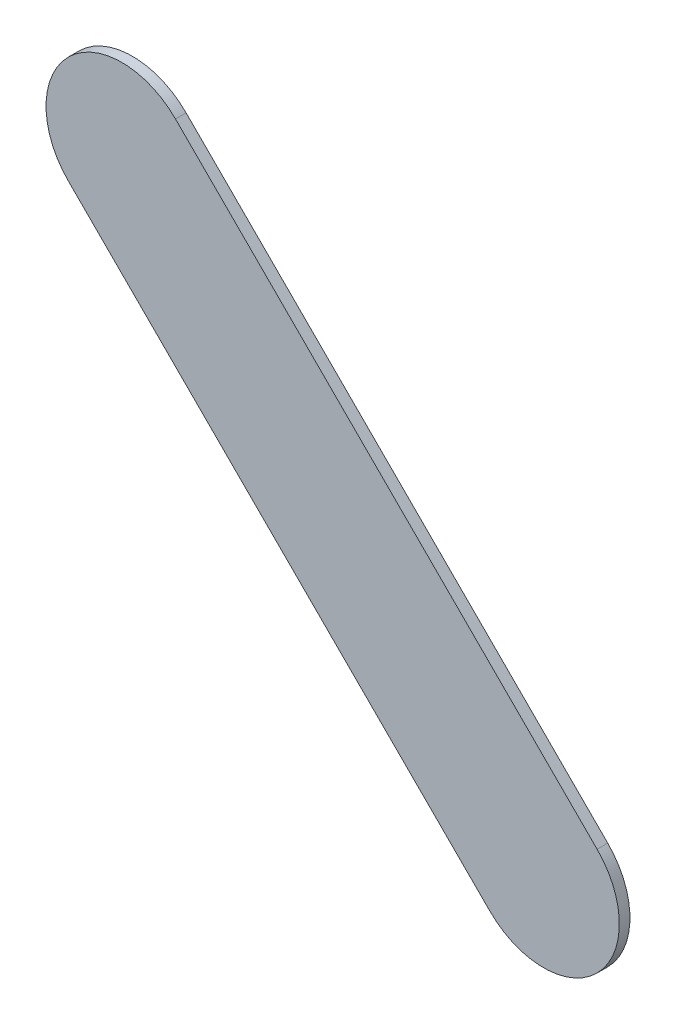
ISO-10303-21;
HEADER;
FILE_DESCRIPTION(('STEP AP214'),'2;1');
FILE_NAME('part.step','',(''),(''),'','','');
FILE_SCHEMA(('AUTOMOTIVE_DESIGN { 1 0 10303 214 1 1 1 1 }'));
ENDSEC;
DATA;
#1=APPLICATION_CONTEXT('core data for automotive mechanical design processes');
#2=APPLICATION_PROTOCOL_DEFINITION('international standard','automotive_design',2000,#1);
#3=PRODUCT_CONTEXT('',#1,'mechanical');
#4=PRODUCT('Part','Part','',(#3));
#5=PRODUCT_RELATED_PRODUCT_CATEGORY('part','',(#4));
#6=PRODUCT_DEFINITION_FORMATION('','',#4);
#7=PRODUCT_DEFINITION_CONTEXT('part definition',#1,'design');
#8=PRODUCT_DEFINITION('design','',#6,#7);
#9=PRODUCT_DEFINITION_SHAPE('','',#8);
#10=(LENGTH_UNIT() NAMED_UNIT(*) SI_UNIT(.MILLI.,.METRE.));
#11=(NAMED_UNIT(*) PLANE_ANGLE_UNIT() SI_UNIT($,.RADIAN.));
#12=(NAMED_UNIT(*) SI_UNIT($,.STERADIAN.) SOLID_ANGLE_UNIT());
#13=UNCERTAINTY_MEASURE_WITH_UNIT(LENGTH_MEASURE(1.E-05),#10,'distance_accuracy_value','');
#14=(GEOMETRIC_REPRESENTATION_CONTEXT(3) GLOBAL_UNCERTAINTY_ASSIGNED_CONTEXT((#13)) GLOBAL_UNIT_ASSIGNED_CONTEXT((#10,
#11,#12)) REPRESENTATION_CONTEXT('',''));
#15=CARTESIAN_POINT('',(0.,0.,0.));
#16=DIRECTION('',(0.,0.,1.));
#17=DIRECTION('',(1.,0.,0.));
#18=AXIS2_PLACEMENT_3D('',#15,#16,#17);
#19=CARTESIAN_POINT('',(104.363223,-71.456776,1.635));
#20=DIRECTION('',(0.,0.,1.));
#21=DIRECTION('',(1.,0.,0.));
#22=AXIS2_PLACEMENT_3D('',#19,#20,#21);
#23=PLANE('',#22);
#24=DIRECTION('',(0.707106781186548,-0.707106781186548,0.));
#25=VECTOR('',#24,1.);
#26=CARTESIAN_POINT('',(104.363223,-71.456776,1.635));
#27=LINE('',#26,#25);
#28=CARTESIAN_POINT('',(104.363223,-71.456776,1.635));
#29=VERTEX_POINT('',#28);
#30=CARTESIAN_POINT('',(105.753223,-72.846776,1.635));
#31=VERTEX_POINT('',#30);
#32=EDGE_CURVE('E69',#29,#31,#27,.T.);
#33=ORIENTED_EDGE('',*,*,#32,.T.);
#34=CARTESIAN_POINT('',(105.9299995,-72.6699995,1.635));
#35=DIRECTION('',(0.,0.,1.));
#36=DIRECTION('',(-0.707106781186548,-0.707106781186548,0.));
#37=AXIS2_PLACEMENT_3D('',#34,#35,#36);
#38=CIRCLE('',#37,0.249999723809);
#39=CARTESIAN_POINT('',(106.106776,-72.493223,1.635));
#40=VERTEX_POINT('',#39);
#41=EDGE_CURVE('E66',#31,#40,#38,.T.);
#42=ORIENTED_EDGE('',*,*,#41,.T.);
#43=DIRECTION('',(-0.707106781186548,0.707106781186548,0.));
#44=VECTOR('',#43,1.);
#45=CARTESIAN_POINT('',(106.106776,-72.493223,1.635));
#46=LINE('',#45,#44);
#47=CARTESIAN_POINT('',(104.716776,-71.103223,1.635));
#48=VERTEX_POINT('',#47);
#49=EDGE_CURVE('E54',#40,#48,#46,.T.);
#50=ORIENTED_EDGE('',*,*,#49,.T.);
#51=CARTESIAN_POINT('',(104.5399995,-71.2799995,1.635));
#52=DIRECTION('',(0.,0.,1.));
#53=DIRECTION('',(0.707106781186548,0.707106781186548,0.));
#54=AXIS2_PLACEMENT_3D('',#51,#52,#53);
#55=CIRCLE('',#54,0.249999723809);
#56=EDGE_CURVE('E11',#48,#29,#55,.T.);
#57=ORIENTED_EDGE('',*,*,#56,.T.);
#58=EDGE_LOOP('',(#33,#42,#50,#57));
#59=FACE_BOUND('',#58,.T.);
#60=ADVANCED_FACE('F17',(#59),#23,.T.);
#61=CARTESIAN_POINT('',(104.363223,-71.456776,1.6));
#62=DIRECTION('',(0.,0.,1.));
#63=DIRECTION('',(1.,0.,0.));
#64=AXIS2_PLACEMENT_3D('',#61,#62,#63);
#65=PLANE('',#64);
#66=CARTESIAN_POINT('',(104.5399995,-71.2799995,1.6));
#67=DIRECTION('',(0.,0.,1.));
#68=DIRECTION('',(0.707106781186548,0.707106781186548,0.));
#69=AXIS2_PLACEMENT_3D('',#66,#67,#68);
#70=CIRCLE('',#69,0.249999723809);
#71=CARTESIAN_POINT('',(104.716776,-71.103223,1.6));
#72=VERTEX_POINT('',#71);
#73=CARTESIAN_POINT('',(104.363223,-71.456776,1.6));
#74=VERTEX_POINT('',#73);
#75=EDGE_CURVE('E20',#72,#74,#70,.T.);
#76=ORIENTED_EDGE('',*,*,#75,.F.);
#77=DIRECTION('',(-0.707106781186548,0.707106781186548,0.));
#78=VECTOR('',#77,1.);
#79=CARTESIAN_POINT('',(106.106776,-72.493223,1.6));
#80=LINE('',#79,#78);
#81=CARTESIAN_POINT('',(106.106776,-72.493223,1.6));
#82=VERTEX_POINT('',#81);
#83=EDGE_CURVE('E74',#82,#72,#80,.T.);
#84=ORIENTED_EDGE('',*,*,#83,.F.);
#85=CARTESIAN_POINT('',(105.9299995,-72.6699995,1.6));
#86=DIRECTION('',(0.,0.,1.));
#87=DIRECTION('',(-0.707106781186548,-0.707106781186548,0.));
#88=AXIS2_PLACEMENT_3D('',#85,#86,#87);
#89=CIRCLE('',#88,0.249999723809);
#90=CARTESIAN_POINT('',(105.753223,-72.846776,1.6));
#91=VERTEX_POINT('',#90);
#92=EDGE_CURVE('E78',#91,#82,#89,.T.);
#93=ORIENTED_EDGE('',*,*,#92,.F.);
#94=DIRECTION('',(0.707106781186548,-0.707106781186548,0.));
#95=VECTOR('',#94,1.);
#96=CARTESIAN_POINT('',(104.363223,-71.456776,1.6));
#97=LINE('',#96,#95);
#98=EDGE_CURVE('E108',#74,#91,#97,.T.);
#99=ORIENTED_EDGE('',*,*,#98,.F.);
#100=EDGE_LOOP('',(#76,#84,#93,#99));
#101=FACE_BOUND('',#100,.T.);
#102=ADVANCED_FACE('F124',(#101),#65,.F.);
#103=CARTESIAN_POINT('',(104.5399995,-71.2799995,1.6));
#104=DIRECTION('',(0.,0.,-1.));
#105=DIRECTION('',(0.707106781186548,0.707106781186548,0.));
#106=AXIS2_PLACEMENT_3D('',#103,#104,#105);
#107=CYLINDRICAL_SURFACE('',#106,0.249999723809);
#108=ORIENTED_EDGE('',*,*,#75,.T.);
#109=DIRECTION('',(0.,0.,1.));
#110=VECTOR('',#109,1.);
#111=CARTESIAN_POINT('',(104.363223,-71.456776,1.6));
#112=LINE('',#111,#110);
#113=EDGE_CURVE('E85',#74,#29,#112,.T.);
#114=ORIENTED_EDGE('',*,*,#113,.T.);
#115=ORIENTED_EDGE('',*,*,#56,.F.);
#116=DIRECTION('',(0.,0.,1.));
#117=VECTOR('',#116,1.);
#118=CARTESIAN_POINT('',(104.716776,-71.103223,1.6));
#119=LINE('',#118,#117);
#120=EDGE_CURVE('E61',#72,#48,#119,.T.);
#121=ORIENTED_EDGE('',*,*,#120,.F.);
#122=EDGE_LOOP('',(#108,#114,#115,#121));
#123=FACE_BOUND('',#122,.T.);
#124=ADVANCED_FACE('F135',(#123),#107,.T.);
#125=CARTESIAN_POINT('',(106.106776,-72.493223,1.6));
#126=DIRECTION('',(-0.707106781186548,-0.707106781186548,0.));
#127=DIRECTION('',(-0.707106781186548,0.707106781186548,0.));
#128=AXIS2_PLACEMENT_3D('',#125,#126,#127);
#129=PLANE('',#128);
#130=ORIENTED_EDGE('',*,*,#83,.T.);
#131=ORIENTED_EDGE('',*,*,#120,.T.);
#132=ORIENTED_EDGE('',*,*,#49,.F.);
#133=DIRECTION('',(0.,0.,1.));
#134=VECTOR('',#133,1.);
#135=CARTESIAN_POINT('',(106.106776,-72.493223,1.6));
#136=LINE('',#135,#134);
#137=EDGE_CURVE('E59',#82,#40,#136,.T.);
#138=ORIENTED_EDGE('',*,*,#137,.F.);
#139=EDGE_LOOP('',(#130,#131,#132,#138));
#140=FACE_BOUND('',#139,.T.);
#141=ADVANCED_FACE('F57',(#140),#129,.F.);
#142=CARTESIAN_POINT('',(105.9299995,-72.6699995,1.6));
#143=DIRECTION('',(0.,0.,-1.));
#144=DIRECTION('',(-0.707106781186548,-0.707106781186548,0.));
#145=AXIS2_PLACEMENT_3D('',#142,#143,#144);
#146=CYLINDRICAL_SURFACE('',#145,0.249999723809);
#147=ORIENTED_EDGE('',*,*,#92,.T.);
#148=ORIENTED_EDGE('',*,*,#137,.T.);
#149=ORIENTED_EDGE('',*,*,#41,.F.);
#150=DIRECTION('',(0.,0.,1.));
#151=VECTOR('',#150,1.);
#152=CARTESIAN_POINT('',(105.753223,-72.846776,1.6));
#153=LINE('',#152,#151);
#154=EDGE_CURVE('E104',#91,#31,#153,.T.);
#155=ORIENTED_EDGE('',*,*,#154,.F.);
#156=EDGE_LOOP('',(#147,#148,#149,#155));
#157=FACE_BOUND('',#156,.T.);
#158=ADVANCED_FACE('F76',(#157),#146,.T.);
#159=CARTESIAN_POINT('',(104.363223,-71.456776,1.6));
#160=DIRECTION('',(0.707106781186548,0.707106781186548,0.));
#161=DIRECTION('',(0.,0.,-1.));
#162=AXIS2_PLACEMENT_3D('',#159,#160,#161);
#163=PLANE('',#162);
#164=ORIENTED_EDGE('',*,*,#98,.T.);
#165=ORIENTED_EDGE('',*,*,#154,.T.);
#166=ORIENTED_EDGE('',*,*,#32,.F.);
#167=ORIENTED_EDGE('',*,*,#113,.F.);
#168=EDGE_LOOP('',(#164,#165,#166,#167));
#169=FACE_BOUND('',#168,.T.);
#170=ADVANCED_FACE('F119',(#169),#163,.F.);
#171=CLOSED_SHELL('',(#60,#102,#124,#141,#158,#170));
#172=MANIFOLD_SOLID_BREP('B1',#171);
#173=ADVANCED_BREP_SHAPE_REPRESENTATION('',(#18,#172),#14);
#174=SHAPE_DEFINITION_REPRESENTATION(#9,#173);
ENDSEC;
END-ISO-10303-21;
